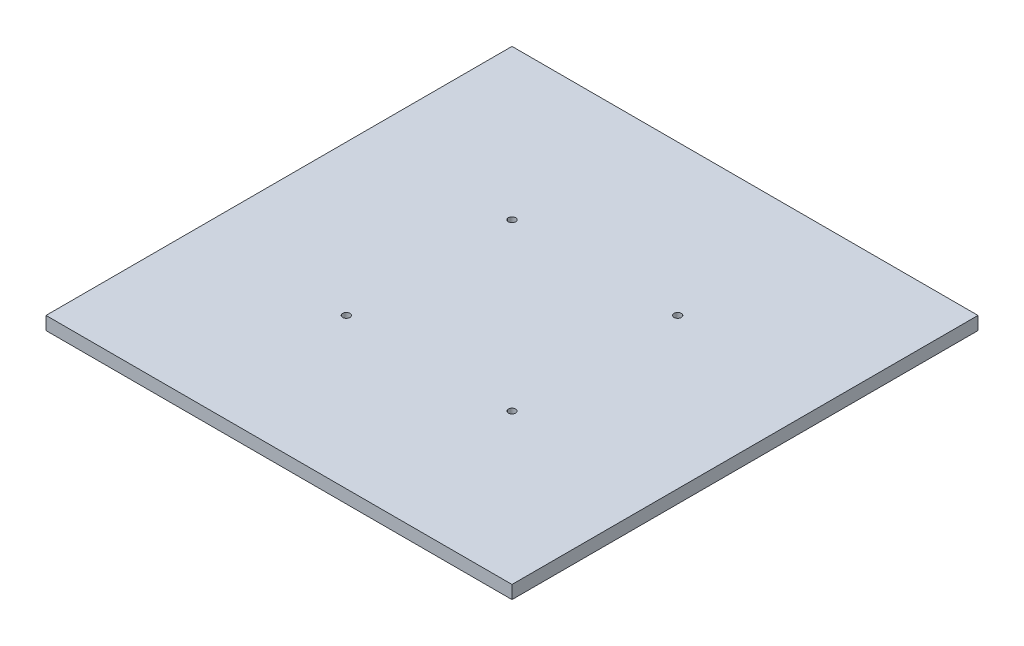
ISO-10303-21;
HEADER;
FILE_DESCRIPTION(('STEP AP214'),'2;1');
FILE_NAME('part.step','',(''),(''),'','','');
FILE_SCHEMA(('AUTOMOTIVE_DESIGN { 1 0 10303 214 1 1 1 1 }'));
ENDSEC;
DATA;
#1=APPLICATION_CONTEXT('core data for automotive mechanical design processes');
#2=APPLICATION_PROTOCOL_DEFINITION('international standard','automotive_design',2000,#1);
#3=PRODUCT_CONTEXT('',#1,'mechanical');
#4=PRODUCT('Part','Part','',(#3));
#5=PRODUCT_RELATED_PRODUCT_CATEGORY('part','',(#4));
#6=PRODUCT_DEFINITION_FORMATION('','',#4);
#7=PRODUCT_DEFINITION_CONTEXT('part definition',#1,'design');
#8=PRODUCT_DEFINITION('design','',#6,#7);
#9=PRODUCT_DEFINITION_SHAPE('','',#8);
#10=(LENGTH_UNIT() NAMED_UNIT(*) SI_UNIT(.MILLI.,.METRE.));
#11=(NAMED_UNIT(*) PLANE_ANGLE_UNIT() SI_UNIT($,.RADIAN.));
#12=(NAMED_UNIT(*) SI_UNIT($,.STERADIAN.) SOLID_ANGLE_UNIT());
#13=UNCERTAINTY_MEASURE_WITH_UNIT(LENGTH_MEASURE(1.E-05),#10,'distance_accuracy_value','');
#14=(GEOMETRIC_REPRESENTATION_CONTEXT(3) GLOBAL_UNCERTAINTY_ASSIGNED_CONTEXT((#13)) GLOBAL_UNIT_ASSIGNED_CONTEXT((#10,
#11,#12)) REPRESENTATION_CONTEXT('',''));
#15=CARTESIAN_POINT('',(0.,0.,0.));
#16=DIRECTION('',(0.,0.,1.));
#17=DIRECTION('',(1.,0.,0.));
#18=AXIS2_PLACEMENT_3D('',#15,#16,#17);
#19=CARTESIAN_POINT('',(225.,12.7,225.));
#20=DIRECTION('',(-1.,0.,0.));
#21=DIRECTION('',(0.,0.,1.));
#22=AXIS2_PLACEMENT_3D('',#19,#20,#21);
#23=PLANE('',#22);
#24=DIRECTION('',(0.,0.,-1.));
#25=VECTOR('',#24,1.);
#26=CARTESIAN_POINT('',(225.,0.,225.));
#27=LINE('',#26,#25);
#28=CARTESIAN_POINT('',(225.,0.,225.));
#29=VERTEX_POINT('',#28);
#30=CARTESIAN_POINT('',(225.,0.,-225.));
#31=VERTEX_POINT('',#30);
#32=EDGE_CURVE('E98',#29,#31,#27,.T.);
#33=ORIENTED_EDGE('',*,*,#32,.T.);
#34=DIRECTION('',(0.,-1.,0.));
#35=VECTOR('',#34,1.);
#36=CARTESIAN_POINT('',(225.,12.7,-225.));
#37=LINE('',#36,#35);
#38=CARTESIAN_POINT('',(225.,12.7,-225.));
#39=VERTEX_POINT('',#38);
#40=EDGE_CURVE('E11',#39,#31,#37,.T.);
#41=ORIENTED_EDGE('',*,*,#40,.F.);
#42=DIRECTION('',(0.,0.,-1.));
#43=VECTOR('',#42,1.);
#44=CARTESIAN_POINT('',(225.,12.7,225.));
#45=LINE('',#44,#43);
#46=CARTESIAN_POINT('',(225.,12.7,225.));
#47=VERTEX_POINT('',#46);
#48=EDGE_CURVE('E86',#47,#39,#45,.T.);
#49=ORIENTED_EDGE('',*,*,#48,.F.);
#50=DIRECTION('',(0.,-1.,0.));
#51=VECTOR('',#50,1.);
#52=CARTESIAN_POINT('',(225.,12.7,225.));
#53=LINE('',#52,#51);
#54=EDGE_CURVE('E94',#47,#29,#53,.T.);
#55=ORIENTED_EDGE('',*,*,#54,.T.);
#56=EDGE_LOOP('',(#33,#41,#49,#55));
#57=FACE_BOUND('',#56,.T.);
#58=ADVANCED_FACE('F35',(#57),#23,.F.);
#59=CARTESIAN_POINT('',(-225.,12.7,-225.));
#60=DIRECTION('',(0.,0.,1.));
#61=DIRECTION('',(1.,0.,0.));
#62=AXIS2_PLACEMENT_3D('',#59,#60,#61);
#63=PLANE('',#62);
#64=DIRECTION('',(-1.,0.,0.));
#65=VECTOR('',#64,1.);
#66=CARTESIAN_POINT('',(-225.,0.,-225.));
#67=LINE('',#66,#65);
#68=CARTESIAN_POINT('',(-225.,0.,-225.));
#69=VERTEX_POINT('',#68);
#70=EDGE_CURVE('E90',#31,#69,#67,.T.);
#71=ORIENTED_EDGE('',*,*,#70,.T.);
#72=DIRECTION('',(0.,-1.,0.));
#73=VECTOR('',#72,1.);
#74=CARTESIAN_POINT('',(-225.,12.7,-225.));
#75=LINE('',#74,#73);
#76=CARTESIAN_POINT('',(-225.,12.7,-225.));
#77=VERTEX_POINT('',#76);
#78=EDGE_CURVE('E43',#77,#69,#75,.T.);
#79=ORIENTED_EDGE('',*,*,#78,.F.);
#80=DIRECTION('',(-1.,0.,0.));
#81=VECTOR('',#80,1.);
#82=CARTESIAN_POINT('',(-225.,12.7,-225.));
#83=LINE('',#82,#81);
#84=EDGE_CURVE('E81',#39,#77,#83,.T.);
#85=ORIENTED_EDGE('',*,*,#84,.F.);
#86=ORIENTED_EDGE('',*,*,#40,.T.);
#87=EDGE_LOOP('',(#71,#79,#85,#86));
#88=FACE_BOUND('',#87,.T.);
#89=ADVANCED_FACE('F89',(#88),#63,.F.);
#90=CARTESIAN_POINT('',(-225.,12.7,225.));
#91=DIRECTION('',(1.,0.,0.));
#92=DIRECTION('',(0.,0.,-1.));
#93=AXIS2_PLACEMENT_3D('',#90,#91,#92);
#94=PLANE('',#93);
#95=DIRECTION('',(0.,0.,1.));
#96=VECTOR('',#95,1.);
#97=CARTESIAN_POINT('',(-225.,0.,225.));
#98=LINE('',#97,#96);
#99=CARTESIAN_POINT('',(-225.,0.,225.));
#100=VERTEX_POINT('',#99);
#101=EDGE_CURVE('E68',#69,#100,#98,.T.);
#102=ORIENTED_EDGE('',*,*,#101,.T.);
#103=DIRECTION('',(0.,-1.,0.));
#104=VECTOR('',#103,1.);
#105=CARTESIAN_POINT('',(-225.,12.7,225.));
#106=LINE('',#105,#104);
#107=CARTESIAN_POINT('',(-225.,12.7,225.));
#108=VERTEX_POINT('',#107);
#109=EDGE_CURVE('E91',#108,#100,#106,.T.);
#110=ORIENTED_EDGE('',*,*,#109,.F.);
#111=DIRECTION('',(0.,0.,1.));
#112=VECTOR('',#111,1.);
#113=CARTESIAN_POINT('',(-225.,12.7,225.));
#114=LINE('',#113,#112);
#115=EDGE_CURVE('E84',#77,#108,#114,.T.);
#116=ORIENTED_EDGE('',*,*,#115,.F.);
#117=ORIENTED_EDGE('',*,*,#78,.T.);
#118=EDGE_LOOP('',(#102,#110,#116,#117));
#119=FACE_BOUND('',#118,.T.);
#120=ADVANCED_FACE('F92',(#119),#94,.F.);
#121=CARTESIAN_POINT('',(-225.,12.7,225.));
#122=DIRECTION('',(0.,0.,-1.));
#123=DIRECTION('',(-1.,0.,0.));
#124=AXIS2_PLACEMENT_3D('',#121,#122,#123);
#125=PLANE('',#124);
#126=DIRECTION('',(1.,0.,0.));
#127=VECTOR('',#126,1.);
#128=CARTESIAN_POINT('',(-225.,0.,225.));
#129=LINE('',#128,#127);
#130=EDGE_CURVE('E74',#100,#29,#129,.T.);
#131=ORIENTED_EDGE('',*,*,#130,.T.);
#132=ORIENTED_EDGE('',*,*,#54,.F.);
#133=DIRECTION('',(1.,0.,0.));
#134=VECTOR('',#133,1.);
#135=CARTESIAN_POINT('',(-225.,12.7,225.));
#136=LINE('',#135,#134);
#137=EDGE_CURVE('E51',#108,#47,#136,.T.);
#138=ORIENTED_EDGE('',*,*,#137,.F.);
#139=ORIENTED_EDGE('',*,*,#109,.T.);
#140=EDGE_LOOP('',(#131,#132,#138,#139));
#141=FACE_BOUND('',#140,.T.);
#142=ADVANCED_FACE('F106',(#141),#125,.F.);
#143=CARTESIAN_POINT('',(0.,12.7,0.));
#144=DIRECTION('',(0.,-1.,0.));
#145=DIRECTION('',(0.,0.,-1.));
#146=AXIS2_PLACEMENT_3D('',#143,#144,#145);
#147=PLANE('',#146);
#148=CARTESIAN_POINT('',(-80.,12.7,-80.));
#149=DIRECTION('',(0.,1.,0.));
#150=DIRECTION('',(0.,0.,1.));
#151=AXIS2_PLACEMENT_3D('',#148,#149,#150);
#152=CIRCLE('',#151,3.49999999999999);
#153=CARTESIAN_POINT('',(-80.,12.7,-76.5));
#154=VERTEX_POINT('',#153);
#155=EDGE_CURVE('E132',#154,#154,#152,.T.);
#156=ORIENTED_EDGE('',*,*,#155,.F.);
#157=EDGE_LOOP('',(#156));
#158=FACE_BOUND('',#157,.T.);
#159=CARTESIAN_POINT('',(80.,12.7,-80.));
#160=DIRECTION('',(0.,1.,0.));
#161=DIRECTION('',(0.,0.,1.));
#162=AXIS2_PLACEMENT_3D('',#159,#160,#161);
#163=CIRCLE('',#162,3.49999999999999);
#164=CARTESIAN_POINT('',(80.,12.7,-76.5));
#165=VERTEX_POINT('',#164);
#166=EDGE_CURVE('E126',#165,#165,#163,.T.);
#167=ORIENTED_EDGE('',*,*,#166,.F.);
#168=EDGE_LOOP('',(#167));
#169=FACE_BOUND('',#168,.T.);
#170=CARTESIAN_POINT('',(80.,12.7,80.));
#171=DIRECTION('',(0.,1.,0.));
#172=DIRECTION('',(0.,0.,1.));
#173=AXIS2_PLACEMENT_3D('',#170,#171,#172);
#174=CIRCLE('',#173,3.49999999999999);
#175=CARTESIAN_POINT('',(80.,12.7,83.5));
#176=VERTEX_POINT('',#175);
#177=EDGE_CURVE('E120',#176,#176,#174,.T.);
#178=ORIENTED_EDGE('',*,*,#177,.F.);
#179=EDGE_LOOP('',(#178));
#180=FACE_BOUND('',#179,.T.);
#181=CARTESIAN_POINT('',(-80.,12.7,80.));
#182=DIRECTION('',(0.,1.,0.));
#183=DIRECTION('',(0.,0.,1.));
#184=AXIS2_PLACEMENT_3D('',#181,#182,#183);
#185=CIRCLE('',#184,3.49999999999999);
#186=CARTESIAN_POINT('',(-80.,12.7,83.5));
#187=VERTEX_POINT('',#186);
#188=EDGE_CURVE('E114',#187,#187,#185,.T.);
#189=ORIENTED_EDGE('',*,*,#188,.F.);
#190=EDGE_LOOP('',(#189));
#191=FACE_BOUND('',#190,.T.);
#192=ORIENTED_EDGE('',*,*,#48,.T.);
#193=ORIENTED_EDGE('',*,*,#84,.T.);
#194=ORIENTED_EDGE('',*,*,#115,.T.);
#195=ORIENTED_EDGE('',*,*,#137,.T.);
#196=EDGE_LOOP('',(#192,#193,#194,#195));
#197=FACE_BOUND('',#196,.T.);
#198=ADVANCED_FACE('F82',(#158,#169,#180,#191,#197),#147,.F.);
#199=CARTESIAN_POINT('',(0.,0.,0.));
#200=DIRECTION('',(0.,-1.,0.));
#201=DIRECTION('',(0.,0.,-1.));
#202=AXIS2_PLACEMENT_3D('',#199,#200,#201);
#203=PLANE('',#202);
#204=CARTESIAN_POINT('',(-80.,0.,-80.));
#205=DIRECTION('',(0.,1.,0.));
#206=DIRECTION('',(0.,0.,1.));
#207=AXIS2_PLACEMENT_3D('',#204,#205,#206);
#208=CIRCLE('',#207,3.5);
#209=CARTESIAN_POINT('',(-80.,0.,-76.5));
#210=VERTEX_POINT('',#209);
#211=EDGE_CURVE('E129',#210,#210,#208,.T.);
#212=ORIENTED_EDGE('',*,*,#211,.T.);
#213=EDGE_LOOP('',(#212));
#214=FACE_BOUND('',#213,.T.);
#215=CARTESIAN_POINT('',(80.,0.,-80.));
#216=DIRECTION('',(0.,1.,0.));
#217=DIRECTION('',(0.,0.,1.));
#218=AXIS2_PLACEMENT_3D('',#215,#216,#217);
#219=CIRCLE('',#218,3.5);
#220=CARTESIAN_POINT('',(80.,0.,-76.5));
#221=VERTEX_POINT('',#220);
#222=EDGE_CURVE('E123',#221,#221,#219,.T.);
#223=ORIENTED_EDGE('',*,*,#222,.T.);
#224=EDGE_LOOP('',(#223));
#225=FACE_BOUND('',#224,.T.);
#226=CARTESIAN_POINT('',(80.,0.,80.));
#227=DIRECTION('',(0.,1.,0.));
#228=DIRECTION('',(0.,0.,1.));
#229=AXIS2_PLACEMENT_3D('',#226,#227,#228);
#230=CIRCLE('',#229,3.5);
#231=CARTESIAN_POINT('',(80.,0.,83.5));
#232=VERTEX_POINT('',#231);
#233=EDGE_CURVE('E117',#232,#232,#230,.T.);
#234=ORIENTED_EDGE('',*,*,#233,.T.);
#235=EDGE_LOOP('',(#234));
#236=FACE_BOUND('',#235,.T.);
#237=CARTESIAN_POINT('',(-80.,0.,80.));
#238=DIRECTION('',(0.,1.,0.));
#239=DIRECTION('',(0.,0.,1.));
#240=AXIS2_PLACEMENT_3D('',#237,#238,#239);
#241=CIRCLE('',#240,3.5);
#242=CARTESIAN_POINT('',(-80.,0.,83.5));
#243=VERTEX_POINT('',#242);
#244=EDGE_CURVE('E101',#243,#243,#241,.T.);
#245=ORIENTED_EDGE('',*,*,#244,.T.);
#246=EDGE_LOOP('',(#245));
#247=FACE_BOUND('',#246,.T.);
#248=ORIENTED_EDGE('',*,*,#32,.F.);
#249=ORIENTED_EDGE('',*,*,#130,.F.);
#250=ORIENTED_EDGE('',*,*,#101,.F.);
#251=ORIENTED_EDGE('',*,*,#70,.F.);
#252=EDGE_LOOP('',(#248,#249,#250,#251));
#253=FACE_BOUND('',#252,.T.);
#254=ADVANCED_FACE('F109',(#214,#225,#236,#247,#253),#203,.T.);
#255=CARTESIAN_POINT('',(-80.,12.7,80.));
#256=DIRECTION('',(0.,1.,0.));
#257=DIRECTION('',(0.,0.,1.));
#258=AXIS2_PLACEMENT_3D('',#255,#256,#257);
#259=CYLINDRICAL_SURFACE('',#258,3.5);
#260=ORIENTED_EDGE('',*,*,#244,.F.);
#261=EDGE_LOOP('',(#260));
#262=FACE_BOUND('',#261,.T.);
#263=ORIENTED_EDGE('',*,*,#188,.T.);
#264=EDGE_LOOP('',(#263));
#265=FACE_BOUND('',#264,.T.);
#266=ADVANCED_FACE('F147',(#262,#265),#259,.F.);
#267=CARTESIAN_POINT('',(80.,12.7,80.));
#268=DIRECTION('',(0.,1.,0.));
#269=DIRECTION('',(0.,0.,1.));
#270=AXIS2_PLACEMENT_3D('',#267,#268,#269);
#271=CYLINDRICAL_SURFACE('',#270,3.5);
#272=ORIENTED_EDGE('',*,*,#233,.F.);
#273=EDGE_LOOP('',(#272));
#274=FACE_BOUND('',#273,.T.);
#275=ORIENTED_EDGE('',*,*,#177,.T.);
#276=EDGE_LOOP('',(#275));
#277=FACE_BOUND('',#276,.T.);
#278=ADVANCED_FACE('F149',(#274,#277),#271,.F.);
#279=CARTESIAN_POINT('',(80.,12.7,-80.));
#280=DIRECTION('',(0.,1.,0.));
#281=DIRECTION('',(0.,0.,1.));
#282=AXIS2_PLACEMENT_3D('',#279,#280,#281);
#283=CYLINDRICAL_SURFACE('',#282,3.5);
#284=ORIENTED_EDGE('',*,*,#222,.F.);
#285=EDGE_LOOP('',(#284));
#286=FACE_BOUND('',#285,.T.);
#287=ORIENTED_EDGE('',*,*,#166,.T.);
#288=EDGE_LOOP('',(#287));
#289=FACE_BOUND('',#288,.T.);
#290=ADVANCED_FACE('F156',(#286,#289),#283,.F.);
#291=CARTESIAN_POINT('',(-80.,12.7,-80.));
#292=DIRECTION('',(0.,1.,0.));
#293=DIRECTION('',(0.,0.,1.));
#294=AXIS2_PLACEMENT_3D('',#291,#292,#293);
#295=CYLINDRICAL_SURFACE('',#294,3.5);
#296=ORIENTED_EDGE('',*,*,#211,.F.);
#297=EDGE_LOOP('',(#296));
#298=FACE_BOUND('',#297,.T.);
#299=ORIENTED_EDGE('',*,*,#155,.T.);
#300=EDGE_LOOP('',(#299));
#301=FACE_BOUND('',#300,.T.);
#302=ADVANCED_FACE('F136',(#298,#301),#295,.F.);
#303=CLOSED_SHELL('',(#58,#89,#120,#142,#198,#254,#266,#278,#290,#302));
#304=MANIFOLD_SOLID_BREP('B2',#303);
#305=ADVANCED_BREP_SHAPE_REPRESENTATION('',(#18,#304),#14);
#306=SHAPE_DEFINITION_REPRESENTATION(#9,#305);
ENDSEC;
END-ISO-10303-21;
